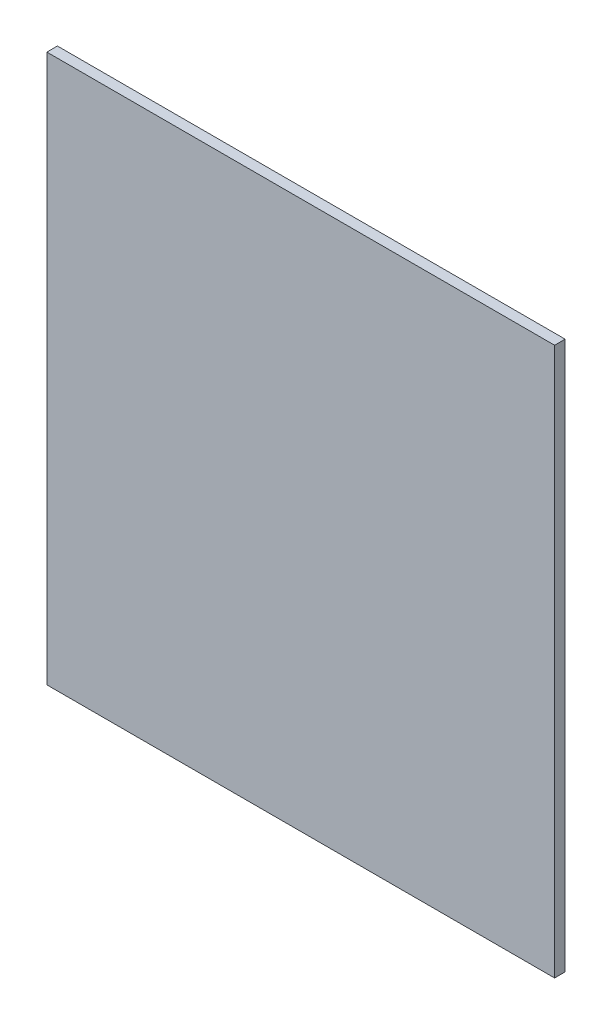
ISO-10303-21;
HEADER;
FILE_DESCRIPTION(('STEP AP214'),'2;1');
FILE_NAME('part.step','',(''),(''),'','','');
FILE_SCHEMA(('AUTOMOTIVE_DESIGN { 1 0 10303 214 1 1 1 1 }'));
ENDSEC;
DATA;
#1=APPLICATION_CONTEXT('core data for automotive mechanical design processes');
#2=APPLICATION_PROTOCOL_DEFINITION('international standard','automotive_design',2000,#1);
#3=PRODUCT_CONTEXT('',#1,'mechanical');
#4=PRODUCT('Part','Part','',(#3));
#5=PRODUCT_RELATED_PRODUCT_CATEGORY('part','',(#4));
#6=PRODUCT_DEFINITION_FORMATION('','',#4);
#7=PRODUCT_DEFINITION_CONTEXT('part definition',#1,'design');
#8=PRODUCT_DEFINITION('design','',#6,#7);
#9=PRODUCT_DEFINITION_SHAPE('','',#8);
#10=(LENGTH_UNIT() NAMED_UNIT(*) SI_UNIT(.MILLI.,.METRE.));
#11=(NAMED_UNIT(*) PLANE_ANGLE_UNIT() SI_UNIT($,.RADIAN.));
#12=(NAMED_UNIT(*) SI_UNIT($,.STERADIAN.) SOLID_ANGLE_UNIT());
#13=UNCERTAINTY_MEASURE_WITH_UNIT(LENGTH_MEASURE(1.E-05),#10,'distance_accuracy_value','');
#14=(GEOMETRIC_REPRESENTATION_CONTEXT(3) GLOBAL_UNCERTAINTY_ASSIGNED_CONTEXT((#13)) GLOBAL_UNIT_ASSIGNED_CONTEXT((#10,
#11,#12)) REPRESENTATION_CONTEXT('',''));
#15=CARTESIAN_POINT('',(0.,0.,0.));
#16=DIRECTION('',(0.,0.,1.));
#17=DIRECTION('',(1.,0.,0.));
#18=AXIS2_PLACEMENT_3D('',#15,#16,#17);
#19=CARTESIAN_POINT('',(24.09,-26.,1.));
#20=DIRECTION('',(-1.,0.,0.));
#21=DIRECTION('',(0.,0.,1.));
#22=AXIS2_PLACEMENT_3D('',#19,#20,#21);
#23=PLANE('',#22);
#24=DIRECTION('',(0.,1.,0.));
#25=VECTOR('',#24,1.);
#26=CARTESIAN_POINT('',(24.09,-26.,0.));
#27=LINE('',#26,#25);
#28=CARTESIAN_POINT('',(24.09,-26.,0.));
#29=VERTEX_POINT('',#28);
#30=CARTESIAN_POINT('',(24.09,26.,0.));
#31=VERTEX_POINT('',#30);
#32=EDGE_CURVE('E96',#29,#31,#27,.T.);
#33=ORIENTED_EDGE('',*,*,#32,.T.);
#34=DIRECTION('',(0.,0.,-1.));
#35=VECTOR('',#34,1.);
#36=CARTESIAN_POINT('',(24.09,26.,1.));
#37=LINE('',#36,#35);
#38=CARTESIAN_POINT('',(24.09,26.,1.));
#39=VERTEX_POINT('',#38);
#40=EDGE_CURVE('E11',#39,#31,#37,.T.);
#41=ORIENTED_EDGE('',*,*,#40,.F.);
#42=DIRECTION('',(0.,1.,0.));
#43=VECTOR('',#42,1.);
#44=CARTESIAN_POINT('',(24.09,-26.,1.));
#45=LINE('',#44,#43);
#46=CARTESIAN_POINT('',(24.09,-26.,1.));
#47=VERTEX_POINT('',#46);
#48=EDGE_CURVE('E84',#47,#39,#45,.T.);
#49=ORIENTED_EDGE('',*,*,#48,.F.);
#50=DIRECTION('',(0.,0.,-1.));
#51=VECTOR('',#50,1.);
#52=CARTESIAN_POINT('',(24.09,-26.,1.));
#53=LINE('',#52,#51);
#54=EDGE_CURVE('E92',#47,#29,#53,.T.);
#55=ORIENTED_EDGE('',*,*,#54,.T.);
#56=EDGE_LOOP('',(#33,#41,#49,#55));
#57=FACE_BOUND('',#56,.T.);
#58=ADVANCED_FACE('F33',(#57),#23,.F.);
#59=CARTESIAN_POINT('',(-24.09,26.,1.));
#60=DIRECTION('',(0.,-1.,0.));
#61=DIRECTION('',(0.,0.,-1.));
#62=AXIS2_PLACEMENT_3D('',#59,#60,#61);
#63=PLANE('',#62);
#64=DIRECTION('',(-1.,0.,0.));
#65=VECTOR('',#64,1.);
#66=CARTESIAN_POINT('',(-24.09,26.,0.));
#67=LINE('',#66,#65);
#68=CARTESIAN_POINT('',(-24.09,26.,0.));
#69=VERTEX_POINT('',#68);
#70=EDGE_CURVE('E88',#31,#69,#67,.T.);
#71=ORIENTED_EDGE('',*,*,#70,.T.);
#72=DIRECTION('',(0.,0.,-1.));
#73=VECTOR('',#72,1.);
#74=CARTESIAN_POINT('',(-24.09,26.,1.));
#75=LINE('',#74,#73);
#76=CARTESIAN_POINT('',(-24.09,26.,1.));
#77=VERTEX_POINT('',#76);
#78=EDGE_CURVE('E41',#77,#69,#75,.T.);
#79=ORIENTED_EDGE('',*,*,#78,.F.);
#80=DIRECTION('',(-1.,0.,0.));
#81=VECTOR('',#80,1.);
#82=CARTESIAN_POINT('',(-24.09,26.,1.));
#83=LINE('',#82,#81);
#84=EDGE_CURVE('E79',#39,#77,#83,.T.);
#85=ORIENTED_EDGE('',*,*,#84,.F.);
#86=ORIENTED_EDGE('',*,*,#40,.T.);
#87=EDGE_LOOP('',(#71,#79,#85,#86));
#88=FACE_BOUND('',#87,.T.);
#89=ADVANCED_FACE('F87',(#88),#63,.F.);
#90=CARTESIAN_POINT('',(-24.09,-26.,1.));
#91=DIRECTION('',(1.,0.,0.));
#92=DIRECTION('',(0.,0.,-1.));
#93=AXIS2_PLACEMENT_3D('',#90,#91,#92);
#94=PLANE('',#93);
#95=DIRECTION('',(0.,-1.,0.));
#96=VECTOR('',#95,1.);
#97=CARTESIAN_POINT('',(-24.09,-26.,0.));
#98=LINE('',#97,#96);
#99=CARTESIAN_POINT('',(-24.09,-26.,0.));
#100=VERTEX_POINT('',#99);
#101=EDGE_CURVE('E66',#69,#100,#98,.T.);
#102=ORIENTED_EDGE('',*,*,#101,.T.);
#103=DIRECTION('',(0.,0.,-1.));
#104=VECTOR('',#103,1.);
#105=CARTESIAN_POINT('',(-24.09,-26.,1.));
#106=LINE('',#105,#104);
#107=CARTESIAN_POINT('',(-24.09,-26.,1.));
#108=VERTEX_POINT('',#107);
#109=EDGE_CURVE('E89',#108,#100,#106,.T.);
#110=ORIENTED_EDGE('',*,*,#109,.F.);
#111=DIRECTION('',(0.,-1.,0.));
#112=VECTOR('',#111,1.);
#113=CARTESIAN_POINT('',(-24.09,-26.,1.));
#114=LINE('',#113,#112);
#115=EDGE_CURVE('E82',#77,#108,#114,.T.);
#116=ORIENTED_EDGE('',*,*,#115,.F.);
#117=ORIENTED_EDGE('',*,*,#78,.T.);
#118=EDGE_LOOP('',(#102,#110,#116,#117));
#119=FACE_BOUND('',#118,.T.);
#120=ADVANCED_FACE('F90',(#119),#94,.F.);
#121=CARTESIAN_POINT('',(-24.09,-26.,1.));
#122=DIRECTION('',(0.,1.,0.));
#123=DIRECTION('',(0.,0.,1.));
#124=AXIS2_PLACEMENT_3D('',#121,#122,#123);
#125=PLANE('',#124);
#126=DIRECTION('',(1.,0.,0.));
#127=VECTOR('',#126,1.);
#128=CARTESIAN_POINT('',(-24.09,-26.,0.));
#129=LINE('',#128,#127);
#130=EDGE_CURVE('E72',#100,#29,#129,.T.);
#131=ORIENTED_EDGE('',*,*,#130,.T.);
#132=ORIENTED_EDGE('',*,*,#54,.F.);
#133=DIRECTION('',(1.,0.,0.));
#134=VECTOR('',#133,1.);
#135=CARTESIAN_POINT('',(-24.09,-26.,1.));
#136=LINE('',#135,#134);
#137=EDGE_CURVE('E49',#108,#47,#136,.T.);
#138=ORIENTED_EDGE('',*,*,#137,.F.);
#139=ORIENTED_EDGE('',*,*,#109,.T.);
#140=EDGE_LOOP('',(#131,#132,#138,#139));
#141=FACE_BOUND('',#140,.T.);
#142=ADVANCED_FACE('F103',(#141),#125,.F.);
#143=CARTESIAN_POINT('',(0.,0.,1.));
#144=DIRECTION('',(0.,0.,-1.));
#145=DIRECTION('',(-1.,0.,0.));
#146=AXIS2_PLACEMENT_3D('',#143,#144,#145);
#147=PLANE('',#146);
#148=ORIENTED_EDGE('',*,*,#48,.T.);
#149=ORIENTED_EDGE('',*,*,#84,.T.);
#150=ORIENTED_EDGE('',*,*,#115,.T.);
#151=ORIENTED_EDGE('',*,*,#137,.T.);
#152=EDGE_LOOP('',(#148,#149,#150,#151));
#153=FACE_BOUND('',#152,.T.);
#154=ADVANCED_FACE('F80',(#153),#147,.F.);
#155=CARTESIAN_POINT('',(0.,0.,0.));
#156=DIRECTION('',(0.,0.,-1.));
#157=DIRECTION('',(-1.,0.,0.));
#158=AXIS2_PLACEMENT_3D('',#155,#156,#157);
#159=PLANE('',#158);
#160=ORIENTED_EDGE('',*,*,#32,.F.);
#161=ORIENTED_EDGE('',*,*,#130,.F.);
#162=ORIENTED_EDGE('',*,*,#101,.F.);
#163=ORIENTED_EDGE('',*,*,#70,.F.);
#164=EDGE_LOOP('',(#160,#161,#162,#163));
#165=FACE_BOUND('',#164,.T.);
#166=ADVANCED_FACE('F106',(#165),#159,.T.);
#167=CLOSED_SHELL('',(#58,#89,#120,#142,#154,#166));
#168=MANIFOLD_SOLID_BREP('B2',#167);
#169=ADVANCED_BREP_SHAPE_REPRESENTATION('',(#18,#168),#14);
#170=SHAPE_DEFINITION_REPRESENTATION(#9,#169);
ENDSEC;
END-ISO-10303-21;
